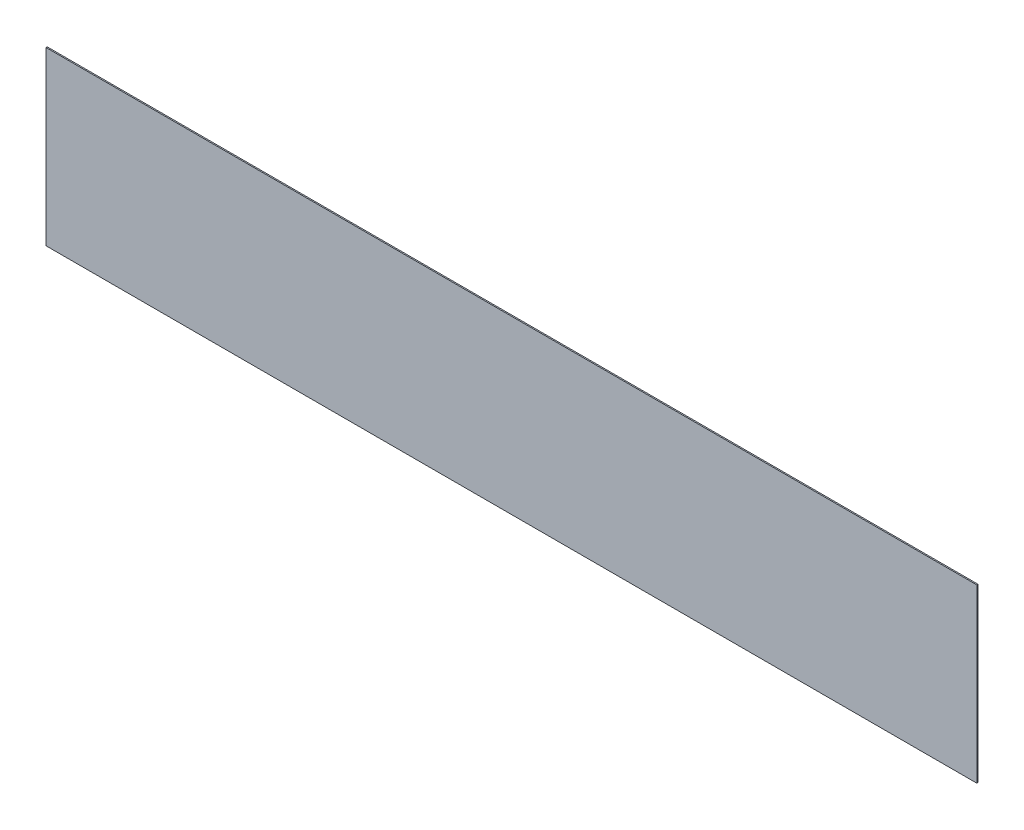
ISO-10303-21;
HEADER;
FILE_DESCRIPTION(('STEP AP214'),'2;1');
FILE_NAME('part.step','',(''),(''),'','','');
FILE_SCHEMA(('AUTOMOTIVE_DESIGN { 1 0 10303 214 1 1 1 1 }'));
ENDSEC;
DATA;
#1=APPLICATION_CONTEXT('core data for automotive mechanical design processes');
#2=APPLICATION_PROTOCOL_DEFINITION('international standard','automotive_design',2000,#1);
#3=PRODUCT_CONTEXT('',#1,'mechanical');
#4=PRODUCT('Part','Part','',(#3));
#5=PRODUCT_RELATED_PRODUCT_CATEGORY('part','',(#4));
#6=PRODUCT_DEFINITION_FORMATION('','',#4);
#7=PRODUCT_DEFINITION_CONTEXT('part definition',#1,'design');
#8=PRODUCT_DEFINITION('design','',#6,#7);
#9=PRODUCT_DEFINITION_SHAPE('','',#8);
#10=(LENGTH_UNIT() NAMED_UNIT(*) SI_UNIT(.MILLI.,.METRE.));
#11=(NAMED_UNIT(*) PLANE_ANGLE_UNIT() SI_UNIT($,.RADIAN.));
#12=(NAMED_UNIT(*) SI_UNIT($,.STERADIAN.) SOLID_ANGLE_UNIT());
#13=UNCERTAINTY_MEASURE_WITH_UNIT(LENGTH_MEASURE(1.E-05),#10,'distance_accuracy_value','');
#14=(GEOMETRIC_REPRESENTATION_CONTEXT(3) GLOBAL_UNCERTAINTY_ASSIGNED_CONTEXT((#13)) GLOBAL_UNIT_ASSIGNED_CONTEXT((#10,
#11,#12)) REPRESENTATION_CONTEXT('',''));
#15=CARTESIAN_POINT('',(0.,0.,0.));
#16=DIRECTION('',(0.,0.,1.));
#17=DIRECTION('',(1.,0.,0.));
#18=AXIS2_PLACEMENT_3D('',#15,#16,#17);
#19=CARTESIAN_POINT('',(0.907174494418365,7.12110813635157,5.));
#20=DIRECTION('',(0.,-1.,0.));
#21=DIRECTION('',(1.,0.,0.));
#22=AXIS2_PLACEMENT_3D('',#19,#20,#21);
#23=PLANE('',#22);
#24=DIRECTION('',(1.,0.,0.));
#25=VECTOR('',#24,1.);
#26=CARTESIAN_POINT('',(2.8488665675891,7.12110813635157,5.005));
#27=LINE('',#26,#25);
#28=CARTESIAN_POINT('',(0.907174494418365,7.12110813635157,5.005));
#29=VERTEX_POINT('',#28);
#30=CARTESIAN_POINT('',(4.79055864075983,7.12110813635157,5.005));
#31=VERTEX_POINT('',#30);
#32=EDGE_CURVE('E70',#29,#31,#27,.T.);
#33=ORIENTED_EDGE('',*,*,#32,.F.);
#34=DIRECTION('',(0.,0.,1.));
#35=VECTOR('',#34,1.);
#36=CARTESIAN_POINT('',(0.907174494418365,7.12110813635157,5.0025));
#37=LINE('',#36,#35);
#38=CARTESIAN_POINT('',(0.907174494418365,7.12110813635157,5.));
#39=VERTEX_POINT('',#38);
#40=EDGE_CURVE('E57',#39,#29,#37,.T.);
#41=ORIENTED_EDGE('',*,*,#40,.F.);
#42=DIRECTION('',(-1.,0.,0.));
#43=VECTOR('',#42,1.);
#44=CARTESIAN_POINT('',(2.8488665675891,7.12110813635157,5.));
#45=LINE('',#44,#43);
#46=CARTESIAN_POINT('',(4.79055864075983,7.12110813635157,5.));
#47=VERTEX_POINT('',#46);
#48=EDGE_CURVE('E63',#47,#39,#45,.T.);
#49=ORIENTED_EDGE('',*,*,#48,.F.);
#50=DIRECTION('',(0.,0.,1.));
#51=VECTOR('',#50,1.);
#52=CARTESIAN_POINT('',(4.79055864075983,7.12110813635157,5.0025));
#53=LINE('',#52,#51);
#54=EDGE_CURVE('E21',#47,#31,#53,.T.);
#55=ORIENTED_EDGE('',*,*,#54,.T.);
#56=EDGE_LOOP('',(#33,#41,#49,#55));
#57=FACE_BOUND('',#56,.T.);
#58=ADVANCED_FACE('F17',(#57),#23,.T.);
#59=CARTESIAN_POINT('',(4.79055864075983,7.12110813635157,5.));
#60=DIRECTION('',(0.,0.,-1.));
#61=DIRECTION('',(-1.,0.,0.));
#62=AXIS2_PLACEMENT_3D('',#59,#60,#61);
#63=PLANE('',#62);
#64=DIRECTION('',(0.,1.,0.));
#65=VECTOR('',#64,1.);
#66=CARTESIAN_POINT('',(4.79055864075983,7.47933984366864,5.));
#67=LINE('',#66,#65);
#68=CARTESIAN_POINT('',(4.79055864075983,7.83757155098572,5.));
#69=VERTEX_POINT('',#68);
#70=EDGE_CURVE('E68',#47,#69,#67,.T.);
#71=ORIENTED_EDGE('',*,*,#70,.F.);
#72=ORIENTED_EDGE('',*,*,#48,.T.);
#73=DIRECTION('',(0.,-1.,0.));
#74=VECTOR('',#73,1.);
#75=CARTESIAN_POINT('',(0.907174494418365,7.47933984366864,5.));
#76=LINE('',#75,#74);
#77=CARTESIAN_POINT('',(0.907174494418365,7.83757155098572,5.));
#78=VERTEX_POINT('',#77);
#79=EDGE_CURVE('E65',#78,#39,#76,.T.);
#80=ORIENTED_EDGE('',*,*,#79,.F.);
#81=DIRECTION('',(-1.,0.,0.));
#82=VECTOR('',#81,1.);
#83=CARTESIAN_POINT('',(2.8488665675891,7.83757155098572,5.));
#84=LINE('',#83,#82);
#85=EDGE_CURVE('E84',#69,#78,#84,.T.);
#86=ORIENTED_EDGE('',*,*,#85,.F.);
#87=EDGE_LOOP('',(#71,#72,#80,#86));
#88=FACE_BOUND('',#87,.T.);
#89=ADVANCED_FACE('F64',(#88),#63,.T.);
#90=CARTESIAN_POINT('',(0.907174494418365,7.83757155098572,5.));
#91=DIRECTION('',(-1.,0.,0.));
#92=DIRECTION('',(0.,-1.,0.));
#93=AXIS2_PLACEMENT_3D('',#90,#91,#92);
#94=PLANE('',#93);
#95=DIRECTION('',(0.,-1.,0.));
#96=VECTOR('',#95,1.);
#97=CARTESIAN_POINT('',(0.907174494418365,7.47933984366864,5.005));
#98=LINE('',#97,#96);
#99=CARTESIAN_POINT('',(0.907174494418365,7.83757155098572,5.005));
#100=VERTEX_POINT('',#99);
#101=EDGE_CURVE('E72',#100,#29,#98,.T.);
#102=ORIENTED_EDGE('',*,*,#101,.F.);
#103=DIRECTION('',(0.,0.,1.));
#104=VECTOR('',#103,1.);
#105=CARTESIAN_POINT('',(0.907174494418365,7.83757155098572,5.0025));
#106=LINE('',#105,#104);
#107=EDGE_CURVE('E76',#78,#100,#106,.T.);
#108=ORIENTED_EDGE('',*,*,#107,.F.);
#109=ORIENTED_EDGE('',*,*,#79,.T.);
#110=ORIENTED_EDGE('',*,*,#40,.T.);
#111=EDGE_LOOP('',(#102,#108,#109,#110));
#112=FACE_BOUND('',#111,.T.);
#113=ADVANCED_FACE('F74',(#112),#94,.T.);
#114=CARTESIAN_POINT('',(0.907174494418365,7.12110813635157,5.005));
#115=DIRECTION('',(0.,0.,1.));
#116=DIRECTION('',(1.,0.,0.));
#117=AXIS2_PLACEMENT_3D('',#114,#115,#116);
#118=PLANE('',#117);
#119=DIRECTION('',(0.,-1.,0.));
#120=VECTOR('',#119,1.);
#121=CARTESIAN_POINT('',(4.79055864075983,7.47933984366864,5.005));
#122=LINE('',#121,#120);
#123=CARTESIAN_POINT('',(4.79055864075983,7.83757155098572,5.005));
#124=VERTEX_POINT('',#123);
#125=EDGE_CURVE('E36',#124,#31,#122,.T.);
#126=ORIENTED_EDGE('',*,*,#125,.F.);
#127=DIRECTION('',(1.,0.,0.));
#128=VECTOR('',#127,1.);
#129=CARTESIAN_POINT('',(2.8488665675891,7.83757155098572,5.005));
#130=LINE('',#129,#128);
#131=EDGE_CURVE('E27',#100,#124,#130,.T.);
#132=ORIENTED_EDGE('',*,*,#131,.F.);
#133=ORIENTED_EDGE('',*,*,#101,.T.);
#134=ORIENTED_EDGE('',*,*,#32,.T.);
#135=EDGE_LOOP('',(#126,#132,#133,#134));
#136=FACE_BOUND('',#135,.T.);
#137=ADVANCED_FACE('F89',(#136),#118,.T.);
#138=CARTESIAN_POINT('',(4.79055864075983,7.12110813635157,5.));
#139=DIRECTION('',(1.,0.,0.));
#140=DIRECTION('',(0.,1.,0.));
#141=AXIS2_PLACEMENT_3D('',#138,#139,#140);
#142=PLANE('',#141);
#143=ORIENTED_EDGE('',*,*,#125,.T.);
#144=ORIENTED_EDGE('',*,*,#54,.F.);
#145=ORIENTED_EDGE('',*,*,#70,.T.);
#146=DIRECTION('',(0.,0.,-1.));
#147=VECTOR('',#146,1.);
#148=CARTESIAN_POINT('',(4.79055864075983,7.83757155098572,5.0025));
#149=LINE('',#148,#147);
#150=EDGE_CURVE('E11',#124,#69,#149,.T.);
#151=ORIENTED_EDGE('',*,*,#150,.F.);
#152=EDGE_LOOP('',(#143,#144,#145,#151));
#153=FACE_BOUND('',#152,.T.);
#154=ADVANCED_FACE('F91',(#153),#142,.T.);
#155=CARTESIAN_POINT('',(4.79055864075983,7.83757155098572,5.));
#156=DIRECTION('',(0.,1.,0.));
#157=DIRECTION('',(-1.,0.,0.));
#158=AXIS2_PLACEMENT_3D('',#155,#156,#157);
#159=PLANE('',#158);
#160=ORIENTED_EDGE('',*,*,#131,.T.);
#161=ORIENTED_EDGE('',*,*,#150,.T.);
#162=ORIENTED_EDGE('',*,*,#85,.T.);
#163=ORIENTED_EDGE('',*,*,#107,.T.);
#164=EDGE_LOOP('',(#160,#161,#162,#163));
#165=FACE_BOUND('',#164,.T.);
#166=ADVANCED_FACE('F19',(#165),#159,.T.);
#167=CLOSED_SHELL('',(#58,#89,#113,#137,#154,#166));
#168=MANIFOLD_SOLID_BREP('B1',#167);
#169=ADVANCED_BREP_SHAPE_REPRESENTATION('',(#18,#168),#14);
#170=SHAPE_DEFINITION_REPRESENTATION(#9,#169);
ENDSEC;
END-ISO-10303-21;
